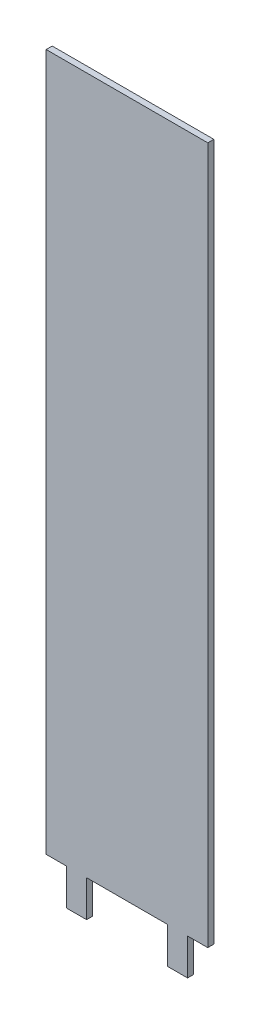
ISO-10303-21;
HEADER;
FILE_DESCRIPTION(('STEP AP214'),'2;1');
FILE_NAME('part.step','',(''),(''),'','','');
FILE_SCHEMA(('AUTOMOTIVE_DESIGN { 1 0 10303 214 1 1 1 1 }'));
ENDSEC;
DATA;
#1=APPLICATION_CONTEXT('core data for automotive mechanical design processes');
#2=APPLICATION_PROTOCOL_DEFINITION('international standard','automotive_design',2000,#1);
#3=PRODUCT_CONTEXT('',#1,'mechanical');
#4=PRODUCT('Part','Part','',(#3));
#5=PRODUCT_RELATED_PRODUCT_CATEGORY('part','',(#4));
#6=PRODUCT_DEFINITION_FORMATION('','',#4);
#7=PRODUCT_DEFINITION_CONTEXT('part definition',#1,'design');
#8=PRODUCT_DEFINITION('design','',#6,#7);
#9=PRODUCT_DEFINITION_SHAPE('','',#8);
#10=(LENGTH_UNIT() NAMED_UNIT(*) SI_UNIT(.MILLI.,.METRE.));
#11=(NAMED_UNIT(*) PLANE_ANGLE_UNIT() SI_UNIT($,.RADIAN.));
#12=(NAMED_UNIT(*) SI_UNIT($,.STERADIAN.) SOLID_ANGLE_UNIT());
#13=UNCERTAINTY_MEASURE_WITH_UNIT(LENGTH_MEASURE(1.E-05),#10,'distance_accuracy_value','');
#14=(GEOMETRIC_REPRESENTATION_CONTEXT(3) GLOBAL_UNCERTAINTY_ASSIGNED_CONTEXT((#13)) GLOBAL_UNIT_ASSIGNED_CONTEXT((#10,
#11,#12)) REPRESENTATION_CONTEXT('',''));
#15=CARTESIAN_POINT('',(0.,0.,0.));
#16=DIRECTION('',(0.,0.,1.));
#17=DIRECTION('',(1.,0.,0.));
#18=AXIS2_PLACEMENT_3D('',#15,#16,#17);
#19=CARTESIAN_POINT('',(0.,0.,0.3));
#20=DIRECTION('',(0.,0.,1.));
#21=DIRECTION('',(1.,0.,0.));
#22=AXIS2_PLACEMENT_3D('',#19,#20,#21);
#23=PLANE('',#22);
#24=DIRECTION('',(1.,0.,0.));
#25=VECTOR('',#24,1.);
#26=CARTESIAN_POINT('',(4.,34.5,0.3));
#27=LINE('',#26,#25);
#28=CARTESIAN_POINT('',(-4.,34.5,0.3));
#29=VERTEX_POINT('',#28);
#30=CARTESIAN_POINT('',(4.,34.5,0.3));
#31=VERTEX_POINT('',#30);
#32=EDGE_CURVE('E74',#29,#31,#27,.T.);
#33=ORIENTED_EDGE('',*,*,#32,.F.);
#34=DIRECTION('',(0.,1.,0.));
#35=VECTOR('',#34,1.);
#36=CARTESIAN_POINT('',(-4.,34.5,0.3));
#37=LINE('',#36,#35);
#38=CARTESIAN_POINT('',(-4.,0.,0.3));
#39=VERTEX_POINT('',#38);
#40=EDGE_CURVE('E119',#39,#29,#37,.T.);
#41=ORIENTED_EDGE('',*,*,#40,.F.);
#42=DIRECTION('',(1.,0.,0.));
#43=VECTOR('',#42,1.);
#44=CARTESIAN_POINT('',(-4.,0.,0.3));
#45=LINE('',#44,#43);
#46=CARTESIAN_POINT('',(-3.,0.,0.3));
#47=VERTEX_POINT('',#46);
#48=EDGE_CURVE('E110',#47,#39,#45,.F.);
#49=ORIENTED_EDGE('',*,*,#48,.F.);
#50=DIRECTION('',(0.,1.,0.));
#51=VECTOR('',#50,1.);
#52=CARTESIAN_POINT('',(-3.,0.,0.3));
#53=LINE('',#52,#51);
#54=CARTESIAN_POINT('',(-3.,-1.8,0.3));
#55=VERTEX_POINT('',#54);
#56=EDGE_CURVE('E124',#55,#47,#53,.T.);
#57=ORIENTED_EDGE('',*,*,#56,.F.);
#58=DIRECTION('',(1.,0.,0.));
#59=VECTOR('',#58,1.);
#60=CARTESIAN_POINT('',(-3.,-1.8,0.3));
#61=LINE('',#60,#59);
#62=CARTESIAN_POINT('',(-2.,-1.8,0.3));
#63=VERTEX_POINT('',#62);
#64=EDGE_CURVE('E128',#63,#55,#61,.F.);
#65=ORIENTED_EDGE('',*,*,#64,.F.);
#66=DIRECTION('',(0.,1.,0.));
#67=VECTOR('',#66,1.);
#68=CARTESIAN_POINT('',(-2.,-1.8,0.3));
#69=LINE('',#68,#67);
#70=CARTESIAN_POINT('',(-2.,0.,0.3));
#71=VERTEX_POINT('',#70);
#72=EDGE_CURVE('E132',#71,#63,#69,.F.);
#73=ORIENTED_EDGE('',*,*,#72,.F.);
#74=DIRECTION('',(1.,0.,0.));
#75=VECTOR('',#74,1.);
#76=CARTESIAN_POINT('',(-2.,0.,0.3));
#77=LINE('',#76,#75);
#78=CARTESIAN_POINT('',(2.,0.,0.3));
#79=VERTEX_POINT('',#78);
#80=EDGE_CURVE('E136',#79,#71,#77,.F.);
#81=ORIENTED_EDGE('',*,*,#80,.F.);
#82=DIRECTION('',(0.,1.,0.));
#83=VECTOR('',#82,1.);
#84=CARTESIAN_POINT('',(2.,0.,0.3));
#85=LINE('',#84,#83);
#86=CARTESIAN_POINT('',(2.,-1.8,0.3));
#87=VERTEX_POINT('',#86);
#88=EDGE_CURVE('E140',#87,#79,#85,.T.);
#89=ORIENTED_EDGE('',*,*,#88,.F.);
#90=DIRECTION('',(1.,0.,0.));
#91=VECTOR('',#90,1.);
#92=CARTESIAN_POINT('',(2.,-1.8,0.3));
#93=LINE('',#92,#91);
#94=CARTESIAN_POINT('',(3.,-1.8,0.3));
#95=VERTEX_POINT('',#94);
#96=EDGE_CURVE('E144',#95,#87,#93,.F.);
#97=ORIENTED_EDGE('',*,*,#96,.F.);
#98=DIRECTION('',(0.,1.,0.));
#99=VECTOR('',#98,1.);
#100=CARTESIAN_POINT('',(3.,-1.8,0.3));
#101=LINE('',#100,#99);
#102=CARTESIAN_POINT('',(3.,0.,0.3));
#103=VERTEX_POINT('',#102);
#104=EDGE_CURVE('E148',#103,#95,#101,.F.);
#105=ORIENTED_EDGE('',*,*,#104,.F.);
#106=DIRECTION('',(1.,0.,0.));
#107=VECTOR('',#106,1.);
#108=CARTESIAN_POINT('',(3.,0.,0.3));
#109=LINE('',#108,#107);
#110=CARTESIAN_POINT('',(4.,0.,0.3));
#111=VERTEX_POINT('',#110);
#112=EDGE_CURVE('E152',#111,#103,#109,.F.);
#113=ORIENTED_EDGE('',*,*,#112,.F.);
#114=DIRECTION('',(0.,1.,0.));
#115=VECTOR('',#114,1.);
#116=CARTESIAN_POINT('',(4.,0.,0.3));
#117=LINE('',#116,#115);
#118=EDGE_CURVE('E156',#31,#111,#117,.F.);
#119=ORIENTED_EDGE('',*,*,#118,.F.);
#120=EDGE_LOOP('',(#33,#41,#49,#57,#65,#73,#81,#89,#97,#105,#113,#119));
#121=FACE_BOUND('',#120,.T.);
#122=ADVANCED_FACE('F15',(#121),#23,.T.);
#123=CARTESIAN_POINT('',(-4.,34.5,0.));
#124=DIRECTION('',(-1.,0.,0.));
#125=DIRECTION('',(0.,0.,1.));
#126=AXIS2_PLACEMENT_3D('',#123,#124,#125);
#127=PLANE('',#126);
#128=DIRECTION('',(0.,0.,1.));
#129=VECTOR('',#128,1.);
#130=CARTESIAN_POINT('',(-4.,34.5,0.));
#131=LINE('',#130,#129);
#132=CARTESIAN_POINT('',(-4.,34.5,0.));
#133=VERTEX_POINT('',#132);
#134=EDGE_CURVE('E160',#133,#29,#131,.T.);
#135=ORIENTED_EDGE('',*,*,#134,.F.);
#136=DIRECTION('',(0.,1.,0.));
#137=VECTOR('',#136,1.);
#138=CARTESIAN_POINT('',(-4.,0.,0.));
#139=LINE('',#138,#137);
#140=CARTESIAN_POINT('',(-4.,0.,0.));
#141=VERTEX_POINT('',#140);
#142=EDGE_CURVE('E19',#133,#141,#139,.F.);
#143=ORIENTED_EDGE('',*,*,#142,.T.);
#144=DIRECTION('',(0.,0.,-1.));
#145=VECTOR('',#144,1.);
#146=CARTESIAN_POINT('',(-4.,0.,0.));
#147=LINE('',#146,#145);
#148=EDGE_CURVE('E115',#39,#141,#147,.T.);
#149=ORIENTED_EDGE('',*,*,#148,.F.);
#150=ORIENTED_EDGE('',*,*,#40,.T.);
#151=EDGE_LOOP('',(#135,#143,#149,#150));
#152=FACE_BOUND('',#151,.T.);
#153=ADVANCED_FACE('F123',(#152),#127,.T.);
#154=CARTESIAN_POINT('',(-4.,0.,0.));
#155=DIRECTION('',(0.,-1.,0.));
#156=DIRECTION('',(0.,0.,-1.));
#157=AXIS2_PLACEMENT_3D('',#154,#155,#156);
#158=PLANE('',#157);
#159=ORIENTED_EDGE('',*,*,#148,.T.);
#160=DIRECTION('',(1.,0.,0.));
#161=VECTOR('',#160,1.);
#162=CARTESIAN_POINT('',(0.,0.,0.));
#163=LINE('',#162,#161);
#164=CARTESIAN_POINT('',(-3.,0.,0.));
#165=VERTEX_POINT('',#164);
#166=EDGE_CURVE('E190',#141,#165,#163,.T.);
#167=ORIENTED_EDGE('',*,*,#166,.T.);
#168=DIRECTION('',(0.,0.,1.));
#169=VECTOR('',#168,1.);
#170=CARTESIAN_POINT('',(-3.,0.,0.));
#171=LINE('',#170,#169);
#172=EDGE_CURVE('E116',#47,#165,#171,.F.);
#173=ORIENTED_EDGE('',*,*,#172,.F.);
#174=ORIENTED_EDGE('',*,*,#48,.T.);
#175=EDGE_LOOP('',(#159,#167,#173,#174));
#176=FACE_BOUND('',#175,.T.);
#177=ADVANCED_FACE('F112',(#176),#158,.T.);
#178=CARTESIAN_POINT('',(-3.,0.,0.));
#179=DIRECTION('',(-1.,0.,0.));
#180=DIRECTION('',(0.,0.,1.));
#181=AXIS2_PLACEMENT_3D('',#178,#179,#180);
#182=PLANE('',#181);
#183=ORIENTED_EDGE('',*,*,#172,.T.);
#184=DIRECTION('',(0.,1.,0.));
#185=VECTOR('',#184,1.);
#186=CARTESIAN_POINT('',(-3.,0.,0.));
#187=LINE('',#186,#185);
#188=CARTESIAN_POINT('',(-3.,-1.8,0.));
#189=VERTEX_POINT('',#188);
#190=EDGE_CURVE('E188',#165,#189,#187,.F.);
#191=ORIENTED_EDGE('',*,*,#190,.T.);
#192=DIRECTION('',(0.,0.,-1.));
#193=VECTOR('',#192,1.);
#194=CARTESIAN_POINT('',(-3.,-1.8,0.));
#195=LINE('',#194,#193);
#196=EDGE_CURVE('E130',#55,#189,#195,.T.);
#197=ORIENTED_EDGE('',*,*,#196,.F.);
#198=ORIENTED_EDGE('',*,*,#56,.T.);
#199=EDGE_LOOP('',(#183,#191,#197,#198));
#200=FACE_BOUND('',#199,.T.);
#201=ADVANCED_FACE('F197',(#200),#182,.T.);
#202=CARTESIAN_POINT('',(-3.,-1.8,0.));
#203=DIRECTION('',(0.,-1.,0.));
#204=DIRECTION('',(0.,0.,-1.));
#205=AXIS2_PLACEMENT_3D('',#202,#203,#204);
#206=PLANE('',#205);
#207=ORIENTED_EDGE('',*,*,#196,.T.);
#208=DIRECTION('',(1.,0.,0.));
#209=VECTOR('',#208,1.);
#210=CARTESIAN_POINT('',(0.,-1.8,0.));
#211=LINE('',#210,#209);
#212=CARTESIAN_POINT('',(-2.,-1.8,0.));
#213=VERTEX_POINT('',#212);
#214=EDGE_CURVE('E185',#189,#213,#211,.T.);
#215=ORIENTED_EDGE('',*,*,#214,.T.);
#216=DIRECTION('',(0.,0.,-1.));
#217=VECTOR('',#216,1.);
#218=CARTESIAN_POINT('',(-2.,-1.8,0.));
#219=LINE('',#218,#217);
#220=EDGE_CURVE('E134',#63,#213,#219,.T.);
#221=ORIENTED_EDGE('',*,*,#220,.F.);
#222=ORIENTED_EDGE('',*,*,#64,.T.);
#223=EDGE_LOOP('',(#207,#215,#221,#222));
#224=FACE_BOUND('',#223,.T.);
#225=ADVANCED_FACE('F204',(#224),#206,.T.);
#226=CARTESIAN_POINT('',(-2.,-1.8,0.));
#227=DIRECTION('',(1.,0.,0.));
#228=DIRECTION('',(0.,0.,-1.));
#229=AXIS2_PLACEMENT_3D('',#226,#227,#228);
#230=PLANE('',#229);
#231=ORIENTED_EDGE('',*,*,#220,.T.);
#232=DIRECTION('',(0.,1.,0.));
#233=VECTOR('',#232,1.);
#234=CARTESIAN_POINT('',(-2.,0.,0.));
#235=LINE('',#234,#233);
#236=CARTESIAN_POINT('',(-2.,0.,0.));
#237=VERTEX_POINT('',#236);
#238=EDGE_CURVE('E182',#213,#237,#235,.T.);
#239=ORIENTED_EDGE('',*,*,#238,.T.);
#240=DIRECTION('',(0.,0.,-1.));
#241=VECTOR('',#240,1.);
#242=CARTESIAN_POINT('',(-2.,0.,0.));
#243=LINE('',#242,#241);
#244=EDGE_CURVE('E138',#71,#237,#243,.T.);
#245=ORIENTED_EDGE('',*,*,#244,.F.);
#246=ORIENTED_EDGE('',*,*,#72,.T.);
#247=EDGE_LOOP('',(#231,#239,#245,#246));
#248=FACE_BOUND('',#247,.T.);
#249=ADVANCED_FACE('F206',(#248),#230,.T.);
#250=CARTESIAN_POINT('',(-2.,0.,0.));
#251=DIRECTION('',(0.,-1.,0.));
#252=DIRECTION('',(0.,0.,-1.));
#253=AXIS2_PLACEMENT_3D('',#250,#251,#252);
#254=PLANE('',#253);
#255=ORIENTED_EDGE('',*,*,#244,.T.);
#256=DIRECTION('',(1.,0.,0.));
#257=VECTOR('',#256,1.);
#258=CARTESIAN_POINT('',(0.,0.,0.));
#259=LINE('',#258,#257);
#260=CARTESIAN_POINT('',(2.,0.,0.));
#261=VERTEX_POINT('',#260);
#262=EDGE_CURVE('E179',#237,#261,#259,.T.);
#263=ORIENTED_EDGE('',*,*,#262,.T.);
#264=DIRECTION('',(0.,0.,1.));
#265=VECTOR('',#264,1.);
#266=CARTESIAN_POINT('',(2.,0.,0.));
#267=LINE('',#266,#265);
#268=EDGE_CURVE('E142',#79,#261,#267,.F.);
#269=ORIENTED_EDGE('',*,*,#268,.F.);
#270=ORIENTED_EDGE('',*,*,#80,.T.);
#271=EDGE_LOOP('',(#255,#263,#269,#270));
#272=FACE_BOUND('',#271,.T.);
#273=ADVANCED_FACE('F212',(#272),#254,.T.);
#274=CARTESIAN_POINT('',(2.,0.,0.));
#275=DIRECTION('',(-1.,0.,0.));
#276=DIRECTION('',(0.,0.,1.));
#277=AXIS2_PLACEMENT_3D('',#274,#275,#276);
#278=PLANE('',#277);
#279=ORIENTED_EDGE('',*,*,#268,.T.);
#280=DIRECTION('',(0.,1.,0.));
#281=VECTOR('',#280,1.);
#282=CARTESIAN_POINT('',(2.,0.,0.));
#283=LINE('',#282,#281);
#284=CARTESIAN_POINT('',(2.,-1.8,0.));
#285=VERTEX_POINT('',#284);
#286=EDGE_CURVE('E176',#261,#285,#283,.F.);
#287=ORIENTED_EDGE('',*,*,#286,.T.);
#288=DIRECTION('',(0.,0.,-1.));
#289=VECTOR('',#288,1.);
#290=CARTESIAN_POINT('',(2.,-1.8,0.));
#291=LINE('',#290,#289);
#292=EDGE_CURVE('E146',#87,#285,#291,.T.);
#293=ORIENTED_EDGE('',*,*,#292,.F.);
#294=ORIENTED_EDGE('',*,*,#88,.T.);
#295=EDGE_LOOP('',(#279,#287,#293,#294));
#296=FACE_BOUND('',#295,.T.);
#297=ADVANCED_FACE('F219',(#296),#278,.T.);
#298=CARTESIAN_POINT('',(2.,-1.8,0.));
#299=DIRECTION('',(0.,-1.,0.));
#300=DIRECTION('',(0.,0.,-1.));
#301=AXIS2_PLACEMENT_3D('',#298,#299,#300);
#302=PLANE('',#301);
#303=ORIENTED_EDGE('',*,*,#292,.T.);
#304=DIRECTION('',(1.,0.,0.));
#305=VECTOR('',#304,1.);
#306=CARTESIAN_POINT('',(0.,-1.8,0.));
#307=LINE('',#306,#305);
#308=CARTESIAN_POINT('',(3.,-1.8,0.));
#309=VERTEX_POINT('',#308);
#310=EDGE_CURVE('E173',#285,#309,#307,.T.);
#311=ORIENTED_EDGE('',*,*,#310,.T.);
#312=DIRECTION('',(0.,0.,-1.));
#313=VECTOR('',#312,1.);
#314=CARTESIAN_POINT('',(3.,-1.8,0.));
#315=LINE('',#314,#313);
#316=EDGE_CURVE('E150',#95,#309,#315,.T.);
#317=ORIENTED_EDGE('',*,*,#316,.F.);
#318=ORIENTED_EDGE('',*,*,#96,.T.);
#319=EDGE_LOOP('',(#303,#311,#317,#318));
#320=FACE_BOUND('',#319,.T.);
#321=ADVANCED_FACE('F221',(#320),#302,.T.);
#322=CARTESIAN_POINT('',(3.,-1.8,0.));
#323=DIRECTION('',(1.,0.,0.));
#324=DIRECTION('',(0.,0.,-1.));
#325=AXIS2_PLACEMENT_3D('',#322,#323,#324);
#326=PLANE('',#325);
#327=ORIENTED_EDGE('',*,*,#316,.T.);
#328=DIRECTION('',(0.,1.,0.));
#329=VECTOR('',#328,1.);
#330=CARTESIAN_POINT('',(3.,0.,0.));
#331=LINE('',#330,#329);
#332=CARTESIAN_POINT('',(3.,0.,0.));
#333=VERTEX_POINT('',#332);
#334=EDGE_CURVE('E170',#309,#333,#331,.T.);
#335=ORIENTED_EDGE('',*,*,#334,.T.);
#336=DIRECTION('',(0.,0.,-1.));
#337=VECTOR('',#336,1.);
#338=CARTESIAN_POINT('',(3.,0.,0.));
#339=LINE('',#338,#337);
#340=EDGE_CURVE('E154',#103,#333,#339,.T.);
#341=ORIENTED_EDGE('',*,*,#340,.F.);
#342=ORIENTED_EDGE('',*,*,#104,.T.);
#343=EDGE_LOOP('',(#327,#335,#341,#342));
#344=FACE_BOUND('',#343,.T.);
#345=ADVANCED_FACE('F226',(#344),#326,.T.);
#346=CARTESIAN_POINT('',(3.,0.,0.));
#347=DIRECTION('',(0.,-1.,0.));
#348=DIRECTION('',(0.,0.,-1.));
#349=AXIS2_PLACEMENT_3D('',#346,#347,#348);
#350=PLANE('',#349);
#351=ORIENTED_EDGE('',*,*,#340,.T.);
#352=DIRECTION('',(1.,0.,0.));
#353=VECTOR('',#352,1.);
#354=CARTESIAN_POINT('',(0.,0.,0.));
#355=LINE('',#354,#353);
#356=CARTESIAN_POINT('',(4.,0.,0.));
#357=VERTEX_POINT('',#356);
#358=EDGE_CURVE('E167',#333,#357,#355,.T.);
#359=ORIENTED_EDGE('',*,*,#358,.T.);
#360=DIRECTION('',(0.,0.,-1.));
#361=VECTOR('',#360,1.);
#362=CARTESIAN_POINT('',(4.,0.,0.));
#363=LINE('',#362,#361);
#364=EDGE_CURVE('E158',#111,#357,#363,.T.);
#365=ORIENTED_EDGE('',*,*,#364,.F.);
#366=ORIENTED_EDGE('',*,*,#112,.T.);
#367=EDGE_LOOP('',(#351,#359,#365,#366));
#368=FACE_BOUND('',#367,.T.);
#369=ADVANCED_FACE('F230',(#368),#350,.T.);
#370=CARTESIAN_POINT('',(4.,0.,0.));
#371=DIRECTION('',(1.,0.,0.));
#372=DIRECTION('',(0.,0.,-1.));
#373=AXIS2_PLACEMENT_3D('',#370,#371,#372);
#374=PLANE('',#373);
#375=ORIENTED_EDGE('',*,*,#364,.T.);
#376=DIRECTION('',(0.,1.,0.));
#377=VECTOR('',#376,1.);
#378=CARTESIAN_POINT('',(4.,0.,0.));
#379=LINE('',#378,#377);
#380=CARTESIAN_POINT('',(4.,34.5,0.));
#381=VERTEX_POINT('',#380);
#382=EDGE_CURVE('E25',#357,#381,#379,.T.);
#383=ORIENTED_EDGE('',*,*,#382,.T.);
#384=DIRECTION('',(0.,0.,1.));
#385=VECTOR('',#384,1.);
#386=CARTESIAN_POINT('',(4.,34.5,0.));
#387=LINE('',#386,#385);
#388=EDGE_CURVE('E33',#31,#381,#387,.F.);
#389=ORIENTED_EDGE('',*,*,#388,.F.);
#390=ORIENTED_EDGE('',*,*,#118,.T.);
#391=EDGE_LOOP('',(#375,#383,#389,#390));
#392=FACE_BOUND('',#391,.T.);
#393=ADVANCED_FACE('F232',(#392),#374,.T.);
#394=CARTESIAN_POINT('',(4.,34.5,0.));
#395=DIRECTION('',(0.,1.,0.));
#396=DIRECTION('',(0.,0.,1.));
#397=AXIS2_PLACEMENT_3D('',#394,#395,#396);
#398=PLANE('',#397);
#399=ORIENTED_EDGE('',*,*,#388,.T.);
#400=DIRECTION('',(1.,0.,0.));
#401=VECTOR('',#400,1.);
#402=CARTESIAN_POINT('',(0.,34.5,0.));
#403=LINE('',#402,#401);
#404=EDGE_CURVE('E10',#381,#133,#403,.F.);
#405=ORIENTED_EDGE('',*,*,#404,.T.);
#406=ORIENTED_EDGE('',*,*,#134,.T.);
#407=ORIENTED_EDGE('',*,*,#32,.T.);
#408=EDGE_LOOP('',(#399,#405,#406,#407));
#409=FACE_BOUND('',#408,.T.);
#410=ADVANCED_FACE('F233',(#409),#398,.T.);
#411=CARTESIAN_POINT('',(0.,0.,0.));
#412=DIRECTION('',(0.,0.,1.));
#413=DIRECTION('',(1.,0.,0.));
#414=AXIS2_PLACEMENT_3D('',#411,#412,#413);
#415=PLANE('',#414);
#416=ORIENTED_EDGE('',*,*,#382,.F.);
#417=ORIENTED_EDGE('',*,*,#358,.F.);
#418=ORIENTED_EDGE('',*,*,#334,.F.);
#419=ORIENTED_EDGE('',*,*,#310,.F.);
#420=ORIENTED_EDGE('',*,*,#286,.F.);
#421=ORIENTED_EDGE('',*,*,#262,.F.);
#422=ORIENTED_EDGE('',*,*,#238,.F.);
#423=ORIENTED_EDGE('',*,*,#214,.F.);
#424=ORIENTED_EDGE('',*,*,#190,.F.);
#425=ORIENTED_EDGE('',*,*,#166,.F.);
#426=ORIENTED_EDGE('',*,*,#142,.F.);
#427=ORIENTED_EDGE('',*,*,#404,.F.);
#428=EDGE_LOOP('',(#416,#417,#418,#419,#420,#421,#422,#423,#424,#425,#426,#427));
#429=FACE_BOUND('',#428,.T.);
#430=ADVANCED_FACE('F17',(#429),#415,.F.);
#431=CLOSED_SHELL('',(#122,#153,#177,#201,#225,#249,#273,#297,#321,#345,#369,#393,#410,#430));
#432=MANIFOLD_SOLID_BREP('B1',#431);
#433=ADVANCED_BREP_SHAPE_REPRESENTATION('',(#18,#432),#14);
#434=SHAPE_DEFINITION_REPRESENTATION(#9,#433);
ENDSEC;
END-ISO-10303-21;
